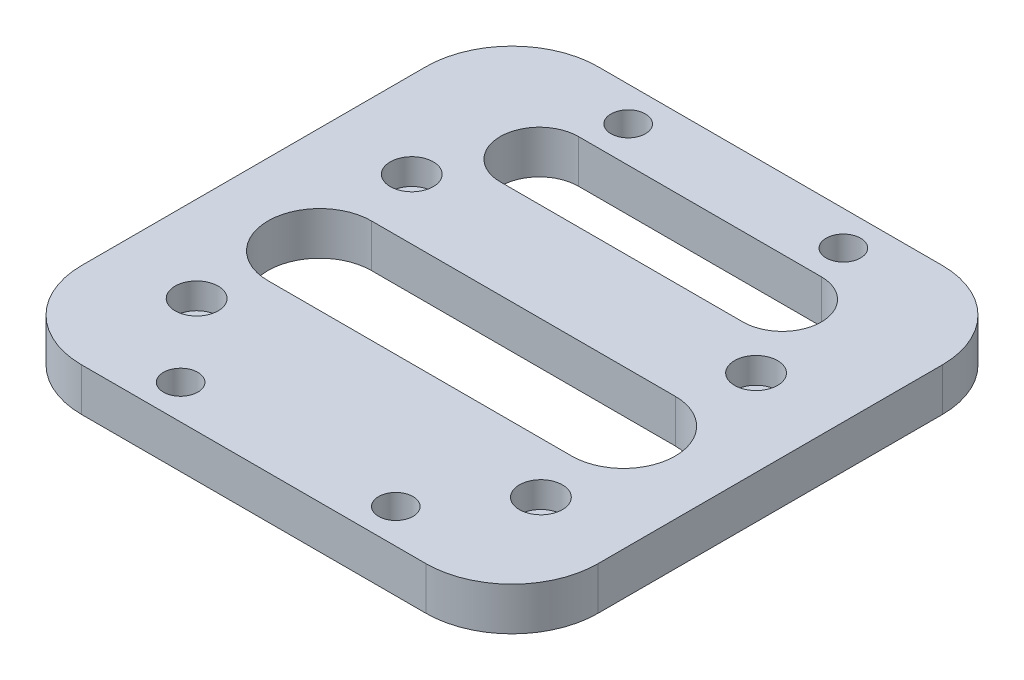
ISO-10303-21;
HEADER;
FILE_DESCRIPTION(('STEP AP214'),'2;1');
FILE_NAME('part.step','',(''),(''),'','','');
FILE_SCHEMA(('AUTOMOTIVE_DESIGN { 1 0 10303 214 1 1 1 1 }'));
ENDSEC;
DATA;
#1=APPLICATION_CONTEXT('core data for automotive mechanical design processes');
#2=APPLICATION_PROTOCOL_DEFINITION('international standard','automotive_design',2000,#1);
#3=PRODUCT_CONTEXT('',#1,'mechanical');
#4=PRODUCT('Part','Part','',(#3));
#5=PRODUCT_RELATED_PRODUCT_CATEGORY('part','',(#4));
#6=PRODUCT_DEFINITION_FORMATION('','',#4);
#7=PRODUCT_DEFINITION_CONTEXT('part definition',#1,'design');
#8=PRODUCT_DEFINITION('design','',#6,#7);
#9=PRODUCT_DEFINITION_SHAPE('','',#8);
#10=(LENGTH_UNIT() NAMED_UNIT(*) SI_UNIT(.MILLI.,.METRE.));
#11=(NAMED_UNIT(*) PLANE_ANGLE_UNIT() SI_UNIT($,.RADIAN.));
#12=(NAMED_UNIT(*) SI_UNIT($,.STERADIAN.) SOLID_ANGLE_UNIT());
#13=UNCERTAINTY_MEASURE_WITH_UNIT(LENGTH_MEASURE(1.E-05),#10,'distance_accuracy_value','');
#14=(GEOMETRIC_REPRESENTATION_CONTEXT(3) GLOBAL_UNCERTAINTY_ASSIGNED_CONTEXT((#13)) GLOBAL_UNIT_ASSIGNED_CONTEXT((#10,
#11,#12)) REPRESENTATION_CONTEXT('',''));
#15=CARTESIAN_POINT('',(0.,0.,0.));
#16=DIRECTION('',(0.,0.,1.));
#17=DIRECTION('',(1.,0.,0.));
#18=AXIS2_PLACEMENT_3D('',#15,#16,#17);
#19=CARTESIAN_POINT('',(50.,0.,-38.358507612628));
#20=DIRECTION('',(0.,1.,0.));
#21=DIRECTION('',(0.,0.,1.));
#22=AXIS2_PLACEMENT_3D('',#19,#20,#21);
#23=CYLINDRICAL_SURFACE('',#22,1.29999999999999);
#24=CARTESIAN_POINT('',(50.,0.,-38.358507612628));
#25=DIRECTION('',(0.,1.,0.));
#26=DIRECTION('',(0.,0.,1.));
#27=AXIS2_PLACEMENT_3D('',#24,#25,#26);
#28=CIRCLE('',#27,1.29999999999999);
#29=CARTESIAN_POINT('',(50.,0.,-37.058507612628));
#30=VERTEX_POINT('',#29);
#31=EDGE_CURVE('E246',#30,#30,#28,.T.);
#32=ORIENTED_EDGE('',*,*,#31,.F.);
#33=EDGE_LOOP('',(#32));
#34=FACE_BOUND('',#33,.T.);
#35=CARTESIAN_POINT('',(50.,2.,-38.358507612628));
#36=DIRECTION('',(0.,1.,0.));
#37=DIRECTION('',(0.,0.,1.));
#38=AXIS2_PLACEMENT_3D('',#35,#36,#37);
#39=CIRCLE('',#38,1.29999999999999);
#40=CARTESIAN_POINT('',(50.,2.,-37.058507612628));
#41=VERTEX_POINT('',#40);
#42=EDGE_CURVE('E249',#41,#41,#39,.F.);
#43=ORIENTED_EDGE('',*,*,#42,.F.);
#44=EDGE_LOOP('',(#43));
#45=FACE_BOUND('',#44,.T.);
#46=ADVANCED_FACE('F33',(#34,#45),#23,.F.);
#47=CARTESIAN_POINT('',(50.,0.,-13.358507612628));
#48=DIRECTION('',(0.,1.,0.));
#49=DIRECTION('',(0.,0.,1.));
#50=AXIS2_PLACEMENT_3D('',#47,#48,#49);
#51=CYLINDRICAL_SURFACE('',#50,1.29999999999999);
#52=CARTESIAN_POINT('',(50.,0.,-13.358507612628));
#53=DIRECTION('',(0.,1.,0.));
#54=DIRECTION('',(0.,0.,1.));
#55=AXIS2_PLACEMENT_3D('',#52,#53,#54);
#56=CIRCLE('',#55,1.29999999999999);
#57=CARTESIAN_POINT('',(50.,0.,-12.0585076126281));
#58=VERTEX_POINT('',#57);
#59=EDGE_CURVE('E243',#58,#58,#56,.T.);
#60=ORIENTED_EDGE('',*,*,#59,.F.);
#61=EDGE_LOOP('',(#60));
#62=FACE_BOUND('',#61,.T.);
#63=CARTESIAN_POINT('',(50.,2.,-13.358507612628));
#64=DIRECTION('',(0.,1.,0.));
#65=DIRECTION('',(0.,0.,1.));
#66=AXIS2_PLACEMENT_3D('',#63,#64,#65);
#67=CIRCLE('',#66,1.29999999999999);
#68=CARTESIAN_POINT('',(50.,2.,-12.0585076126281));
#69=VERTEX_POINT('',#68);
#70=EDGE_CURVE('E306',#69,#69,#67,.F.);
#71=ORIENTED_EDGE('',*,*,#70,.F.);
#72=EDGE_LOOP('',(#71));
#73=FACE_BOUND('',#72,.T.);
#74=ADVANCED_FACE('F388',(#62,#73),#51,.F.);
#75=CARTESIAN_POINT('',(10.,0.,-13.358507612628));
#76=DIRECTION('',(0.,1.,0.));
#77=DIRECTION('',(0.,0.,1.));
#78=AXIS2_PLACEMENT_3D('',#75,#76,#77);
#79=CYLINDRICAL_SURFACE('',#78,1.3);
#80=CARTESIAN_POINT('',(10.,0.,-13.358507612628));
#81=DIRECTION('',(0.,1.,0.));
#82=DIRECTION('',(0.,0.,1.));
#83=AXIS2_PLACEMENT_3D('',#80,#81,#82);
#84=CIRCLE('',#83,1.3);
#85=CARTESIAN_POINT('',(10.,0.,-12.058507612628));
#86=VERTEX_POINT('',#85);
#87=EDGE_CURVE('E239',#86,#86,#84,.T.);
#88=ORIENTED_EDGE('',*,*,#87,.F.);
#89=EDGE_LOOP('',(#88));
#90=FACE_BOUND('',#89,.T.);
#91=CARTESIAN_POINT('',(10.,2.,-13.358507612628));
#92=DIRECTION('',(0.,1.,0.));
#93=DIRECTION('',(0.,0.,1.));
#94=AXIS2_PLACEMENT_3D('',#91,#92,#93);
#95=CIRCLE('',#94,1.3);
#96=CARTESIAN_POINT('',(10.,2.,-12.058507612628));
#97=VERTEX_POINT('',#96);
#98=EDGE_CURVE('E303',#97,#97,#95,.F.);
#99=ORIENTED_EDGE('',*,*,#98,.F.);
#100=EDGE_LOOP('',(#99));
#101=FACE_BOUND('',#100,.T.);
#102=ADVANCED_FACE('F394',(#90,#101),#79,.F.);
#103=CARTESIAN_POINT('',(10.,0.,-38.358507612628));
#104=DIRECTION('',(0.,1.,0.));
#105=DIRECTION('',(0.,0.,1.));
#106=AXIS2_PLACEMENT_3D('',#103,#104,#105);
#107=CYLINDRICAL_SURFACE('',#106,1.3);
#108=CARTESIAN_POINT('',(10.,0.,-38.358507612628));
#109=DIRECTION('',(0.,1.,0.));
#110=DIRECTION('',(0.,0.,1.));
#111=AXIS2_PLACEMENT_3D('',#108,#109,#110);
#112=CIRCLE('',#111,1.3);
#113=CARTESIAN_POINT('',(10.,0.,-37.058507612628));
#114=VERTEX_POINT('',#113);
#115=EDGE_CURVE('E242',#114,#114,#112,.T.);
#116=ORIENTED_EDGE('',*,*,#115,.F.);
#117=EDGE_LOOP('',(#116));
#118=FACE_BOUND('',#117,.T.);
#119=CARTESIAN_POINT('',(10.,2.,-38.358507612628));
#120=DIRECTION('',(0.,1.,0.));
#121=DIRECTION('',(0.,0.,1.));
#122=AXIS2_PLACEMENT_3D('',#119,#120,#121);
#123=CIRCLE('',#122,1.3);
#124=CARTESIAN_POINT('',(10.,2.,-37.058507612628));
#125=VERTEX_POINT('',#124);
#126=EDGE_CURVE('E236',#125,#125,#123,.F.);
#127=ORIENTED_EDGE('',*,*,#126,.F.);
#128=EDGE_LOOP('',(#127));
#129=FACE_BOUND('',#128,.T.);
#130=ADVANCED_FACE('F415',(#118,#129),#107,.F.);
#131=CARTESIAN_POINT('',(0.,5.,0.));
#132=DIRECTION('',(1.,0.,0.));
#133=DIRECTION('',(0.,0.,-1.));
#134=AXIS2_PLACEMENT_3D('',#131,#132,#133);
#135=PLANE('',#134);
#136=DIRECTION('',(0.,0.,1.));
#137=VECTOR('',#136,1.);
#138=CARTESIAN_POINT('',(0.,0.,0.));
#139=LINE('',#138,#137);
#140=CARTESIAN_POINT('',(0.,0.,-50.));
#141=VERTEX_POINT('',#140);
#142=CARTESIAN_POINT('',(0.,0.,-10.));
#143=VERTEX_POINT('',#142);
#144=EDGE_CURVE('E274',#141,#143,#139,.T.);
#145=ORIENTED_EDGE('',*,*,#144,.T.);
#146=DIRECTION('',(0.,-1.,0.));
#147=VECTOR('',#146,1.);
#148=CARTESIAN_POINT('',(0.,5.,-10.));
#149=LINE('',#148,#147);
#150=CARTESIAN_POINT('',(0.,5.,-10.));
#151=VERTEX_POINT('',#150);
#152=EDGE_CURVE('E11',#143,#151,#149,.F.);
#153=ORIENTED_EDGE('',*,*,#152,.T.);
#154=DIRECTION('',(0.,0.,1.));
#155=VECTOR('',#154,1.);
#156=CARTESIAN_POINT('',(0.,5.,0.));
#157=LINE('',#156,#155);
#158=CARTESIAN_POINT('',(0.,5.,-50.));
#159=VERTEX_POINT('',#158);
#160=EDGE_CURVE('E277',#159,#151,#157,.T.);
#161=ORIENTED_EDGE('',*,*,#160,.F.);
#162=DIRECTION('',(0.,-1.,0.));
#163=VECTOR('',#162,1.);
#164=CARTESIAN_POINT('',(0.,5.,-50.));
#165=LINE('',#164,#163);
#166=EDGE_CURVE('E41',#159,#141,#165,.T.);
#167=ORIENTED_EDGE('',*,*,#166,.T.);
#168=EDGE_LOOP('',(#145,#153,#161,#167));
#169=FACE_BOUND('',#168,.T.);
#170=ADVANCED_FACE('F345',(#169),#135,.F.);
#171=CARTESIAN_POINT('',(0.,5.,0.));
#172=DIRECTION('',(0.,0.,-1.));
#173=DIRECTION('',(-1.,0.,0.));
#174=AXIS2_PLACEMENT_3D('',#171,#172,#173);
#175=PLANE('',#174);
#176=DIRECTION('',(1.,0.,0.));
#177=VECTOR('',#176,1.);
#178=CARTESIAN_POINT('',(0.,0.,0.));
#179=LINE('',#178,#177);
#180=CARTESIAN_POINT('',(10.,0.,0.));
#181=VERTEX_POINT('',#180);
#182=CARTESIAN_POINT('',(50.,0.,0.));
#183=VERTEX_POINT('',#182);
#184=EDGE_CURVE('E293',#181,#183,#179,.T.);
#185=ORIENTED_EDGE('',*,*,#184,.T.);
#186=DIRECTION('',(0.,-1.,0.));
#187=VECTOR('',#186,1.);
#188=CARTESIAN_POINT('',(50.,5.,0.));
#189=LINE('',#188,#187);
#190=CARTESIAN_POINT('',(50.,5.,0.));
#191=VERTEX_POINT('',#190);
#192=EDGE_CURVE('E326',#183,#191,#189,.F.);
#193=ORIENTED_EDGE('',*,*,#192,.T.);
#194=DIRECTION('',(1.,0.,0.));
#195=VECTOR('',#194,1.);
#196=CARTESIAN_POINT('',(0.,5.,0.));
#197=LINE('',#196,#195);
#198=CARTESIAN_POINT('',(10.,5.,0.));
#199=VERTEX_POINT('',#198);
#200=EDGE_CURVE('E280',#199,#191,#197,.T.);
#201=ORIENTED_EDGE('',*,*,#200,.F.);
#202=DIRECTION('',(0.,-1.,0.));
#203=VECTOR('',#202,1.);
#204=CARTESIAN_POINT('',(10.,5.,0.));
#205=LINE('',#204,#203);
#206=EDGE_CURVE('E323',#199,#181,#205,.T.);
#207=ORIENTED_EDGE('',*,*,#206,.T.);
#208=EDGE_LOOP('',(#185,#193,#201,#207));
#209=FACE_BOUND('',#208,.T.);
#210=ADVANCED_FACE('F359',(#209),#175,.F.);
#211=CARTESIAN_POINT('',(60.,5.,0.));
#212=DIRECTION('',(-1.,0.,0.));
#213=DIRECTION('',(0.,0.,1.));
#214=AXIS2_PLACEMENT_3D('',#211,#212,#213);
#215=PLANE('',#214);
#216=DIRECTION('',(0.,0.,-1.));
#217=VECTOR('',#216,1.);
#218=CARTESIAN_POINT('',(60.,5.,0.));
#219=LINE('',#218,#217);
#220=CARTESIAN_POINT('',(60.,5.,-10.));
#221=VERTEX_POINT('',#220);
#222=CARTESIAN_POINT('',(60.,5.,-50.));
#223=VERTEX_POINT('',#222);
#224=EDGE_CURVE('E284',#221,#223,#219,.T.);
#225=ORIENTED_EDGE('',*,*,#224,.F.);
#226=DIRECTION('',(0.,-1.,0.));
#227=VECTOR('',#226,1.);
#228=CARTESIAN_POINT('',(60.,5.,-10.));
#229=LINE('',#228,#227);
#230=CARTESIAN_POINT('',(60.,0.,-10.));
#231=VERTEX_POINT('',#230);
#232=EDGE_CURVE('E312',#221,#231,#229,.T.);
#233=ORIENTED_EDGE('',*,*,#232,.T.);
#234=DIRECTION('',(0.,0.,-1.));
#235=VECTOR('',#234,1.);
#236=CARTESIAN_POINT('',(60.,0.,0.));
#237=LINE('',#236,#235);
#238=CARTESIAN_POINT('',(60.,0.,-50.));
#239=VERTEX_POINT('',#238);
#240=EDGE_CURVE('E296',#231,#239,#237,.T.);
#241=ORIENTED_EDGE('',*,*,#240,.T.);
#242=DIRECTION('',(0.,-1.,0.));
#243=VECTOR('',#242,1.);
#244=CARTESIAN_POINT('',(60.,5.,-50.));
#245=LINE('',#244,#243);
#246=EDGE_CURVE('E290',#239,#223,#245,.F.);
#247=ORIENTED_EDGE('',*,*,#246,.T.);
#248=EDGE_LOOP('',(#225,#233,#241,#247));
#249=FACE_BOUND('',#248,.T.);
#250=ADVANCED_FACE('F369',(#249),#215,.F.);
#251=CARTESIAN_POINT('',(0.,5.,-60.));
#252=DIRECTION('',(0.,0.,1.));
#253=DIRECTION('',(1.,0.,0.));
#254=AXIS2_PLACEMENT_3D('',#251,#252,#253);
#255=PLANE('',#254);
#256=DIRECTION('',(-1.,0.,0.));
#257=VECTOR('',#256,1.);
#258=CARTESIAN_POINT('',(0.,5.,-60.));
#259=LINE('',#258,#257);
#260=CARTESIAN_POINT('',(50.,5.,-60.));
#261=VERTEX_POINT('',#260);
#262=CARTESIAN_POINT('',(10.,5.,-60.));
#263=VERTEX_POINT('',#262);
#264=EDGE_CURVE('E287',#261,#263,#259,.T.);
#265=ORIENTED_EDGE('',*,*,#264,.F.);
#266=DIRECTION('',(0.,-1.,0.));
#267=VECTOR('',#266,1.);
#268=CARTESIAN_POINT('',(50.,5.,-60.));
#269=LINE('',#268,#267);
#270=CARTESIAN_POINT('',(50.,0.,-60.));
#271=VERTEX_POINT('',#270);
#272=EDGE_CURVE('E338',#261,#271,#269,.T.);
#273=ORIENTED_EDGE('',*,*,#272,.T.);
#274=DIRECTION('',(-1.,0.,0.));
#275=VECTOR('',#274,1.);
#276=CARTESIAN_POINT('',(0.,0.,-60.));
#277=LINE('',#276,#275);
#278=CARTESIAN_POINT('',(10.,0.,-60.));
#279=VERTEX_POINT('',#278);
#280=EDGE_CURVE('E281',#271,#279,#277,.T.);
#281=ORIENTED_EDGE('',*,*,#280,.T.);
#282=DIRECTION('',(0.,-1.,0.));
#283=VECTOR('',#282,1.);
#284=CARTESIAN_POINT('',(10.,5.,-60.));
#285=LINE('',#284,#283);
#286=EDGE_CURVE('E336',#279,#263,#285,.F.);
#287=ORIENTED_EDGE('',*,*,#286,.T.);
#288=EDGE_LOOP('',(#265,#273,#281,#287));
#289=FACE_BOUND('',#288,.T.);
#290=ADVANCED_FACE('F377',(#289),#255,.F.);
#291=CARTESIAN_POINT('',(0.,5.,0.));
#292=DIRECTION('',(0.,-1.,0.));
#293=DIRECTION('',(0.,0.,-1.));
#294=AXIS2_PLACEMENT_3D('',#291,#292,#293);
#295=PLANE('',#294);
#296=DIRECTION('',(1.,0.,0.));
#297=VECTOR('',#296,1.);
#298=CARTESIAN_POINT('',(15.8935843316395,5.,-42.7294946170664));
#299=LINE('',#298,#297);
#300=CARTESIAN_POINT('',(15.8935843316395,5.,-42.7294946170664));
#301=VERTEX_POINT('',#300);
#302=CARTESIAN_POINT('',(44.1064156683605,5.,-42.7294946170664));
#303=VERTEX_POINT('',#302);
#304=EDGE_CURVE('E175',#301,#303,#299,.T.);
#305=ORIENTED_EDGE('',*,*,#304,.F.);
#306=CARTESIAN_POINT('',(15.8935843316395,5.,-47.2817642152225));
#307=DIRECTION('',(0.,1.,0.));
#308=DIRECTION('',(0.,0.,1.));
#309=AXIS2_PLACEMENT_3D('',#306,#307,#308);
#310=CIRCLE('',#309,4.55226959815617);
#311=CARTESIAN_POINT('',(15.8935843316395,5.,-51.8340338133787));
#312=VERTEX_POINT('',#311);
#313=EDGE_CURVE('E48',#312,#301,#310,.T.);
#314=ORIENTED_EDGE('',*,*,#313,.F.);
#315=DIRECTION('',(-1.,0.,0.));
#316=VECTOR('',#315,1.);
#317=CARTESIAN_POINT('',(15.8935843316395,5.,-51.8340338133787));
#318=LINE('',#317,#316);
#319=CARTESIAN_POINT('',(44.1064156683605,5.,-51.8340338133787));
#320=VERTEX_POINT('',#319);
#321=EDGE_CURVE('E166',#320,#312,#318,.T.);
#322=ORIENTED_EDGE('',*,*,#321,.F.);
#323=CARTESIAN_POINT('',(44.1064156683605,5.,-47.2817642152225));
#324=DIRECTION('',(0.,1.,0.));
#325=DIRECTION('',(0.,0.,1.));
#326=AXIS2_PLACEMENT_3D('',#323,#324,#325);
#327=CIRCLE('',#326,4.55226959815617);
#328=EDGE_CURVE('E169',#303,#320,#327,.T.);
#329=ORIENTED_EDGE('',*,*,#328,.F.);
#330=EDGE_LOOP('',(#305,#314,#322,#329));
#331=FACE_BOUND('',#330,.T.);
#332=DIRECTION('',(1.,0.,0.));
#333=VECTOR('',#332,1.);
#334=CARTESIAN_POINT('',(12.3529301997403,5.,-19.2937363154475));
#335=LINE('',#334,#333);
#336=CARTESIAN_POINT('',(12.3529301997403,5.,-19.2937363154475));
#337=VERTEX_POINT('',#336);
#338=CARTESIAN_POINT('',(47.6470698002597,5.,-19.2937363154475));
#339=VERTEX_POINT('',#338);
#340=EDGE_CURVE('E201',#337,#339,#335,.T.);
#341=ORIENTED_EDGE('',*,*,#340,.F.);
#342=CARTESIAN_POINT('',(12.3529301997403,5.,-25.3072282537526));
#343=DIRECTION('',(0.,1.,0.));
#344=DIRECTION('',(0.,0.,1.));
#345=AXIS2_PLACEMENT_3D('',#342,#343,#344);
#346=CIRCLE('',#345,6.01349193830507);
#347=CARTESIAN_POINT('',(12.3529301997403,5.,-31.3207201920577));
#348=VERTEX_POINT('',#347);
#349=EDGE_CURVE('E56',#348,#337,#346,.T.);
#350=ORIENTED_EDGE('',*,*,#349,.F.);
#351=DIRECTION('',(-1.,0.,0.));
#352=VECTOR('',#351,1.);
#353=CARTESIAN_POINT('',(12.3529301997403,5.,-31.3207201920577));
#354=LINE('',#353,#352);
#355=CARTESIAN_POINT('',(47.6470698002597,5.,-31.3207201920577));
#356=VERTEX_POINT('',#355);
#357=EDGE_CURVE('E190',#356,#348,#354,.T.);
#358=ORIENTED_EDGE('',*,*,#357,.F.);
#359=CARTESIAN_POINT('',(47.6470698002597,5.,-25.3072282537526));
#360=DIRECTION('',(0.,1.,0.));
#361=DIRECTION('',(0.,0.,1.));
#362=AXIS2_PLACEMENT_3D('',#359,#360,#361);
#363=CIRCLE('',#362,6.01349193830507);
#364=EDGE_CURVE('E204',#339,#356,#363,.T.);
#365=ORIENTED_EDGE('',*,*,#364,.F.);
#366=EDGE_LOOP('',(#341,#350,#358,#365));
#367=FACE_BOUND('',#366,.T.);
#368=CARTESIAN_POINT('',(50.,5.,-38.358507612628));
#369=DIRECTION('',(0.,1.,0.));
#370=DIRECTION('',(0.,0.,1.));
#371=AXIS2_PLACEMENT_3D('',#368,#369,#370);
#372=CIRCLE('',#371,2.5);
#373=CARTESIAN_POINT('',(50.,5.,-35.8585076126281));
#374=VERTEX_POINT('',#373);
#375=EDGE_CURVE('E182',#374,#374,#372,.T.);
#376=ORIENTED_EDGE('',*,*,#375,.F.);
#377=EDGE_LOOP('',(#376));
#378=FACE_BOUND('',#377,.T.);
#379=CARTESIAN_POINT('',(50.,5.,-13.358507612628));
#380=DIRECTION('',(0.,1.,0.));
#381=DIRECTION('',(0.,0.,1.));
#382=AXIS2_PLACEMENT_3D('',#379,#380,#381);
#383=CIRCLE('',#382,2.49999999999999);
#384=CARTESIAN_POINT('',(50.,5.,-10.858507612628));
#385=VERTEX_POINT('',#384);
#386=EDGE_CURVE('E225',#385,#385,#383,.T.);
#387=ORIENTED_EDGE('',*,*,#386,.F.);
#388=EDGE_LOOP('',(#387));
#389=FACE_BOUND('',#388,.T.);
#390=CARTESIAN_POINT('',(10.,5.,-13.358507612628));
#391=DIRECTION('',(0.,1.,0.));
#392=DIRECTION('',(0.,0.,1.));
#393=AXIS2_PLACEMENT_3D('',#390,#391,#392);
#394=CIRCLE('',#393,2.5);
#395=CARTESIAN_POINT('',(10.,5.,-10.858507612628));
#396=VERTEX_POINT('',#395);
#397=EDGE_CURVE('E219',#396,#396,#394,.T.);
#398=ORIENTED_EDGE('',*,*,#397,.F.);
#399=EDGE_LOOP('',(#398));
#400=FACE_BOUND('',#399,.T.);
#401=CARTESIAN_POINT('',(10.,5.,-38.358507612628));
#402=DIRECTION('',(0.,1.,0.));
#403=DIRECTION('',(0.,0.,1.));
#404=AXIS2_PLACEMENT_3D('',#401,#402,#403);
#405=CIRCLE('',#404,2.5);
#406=CARTESIAN_POINT('',(10.,5.,-35.858507612628));
#407=VERTEX_POINT('',#406);
#408=EDGE_CURVE('E218',#407,#407,#405,.T.);
#409=ORIENTED_EDGE('',*,*,#408,.F.);
#410=EDGE_LOOP('',(#409));
#411=FACE_BOUND('',#410,.T.);
#412=CARTESIAN_POINT('',(17.5,5.,-4.));
#413=DIRECTION('',(0.,1.,0.));
#414=DIRECTION('',(0.,0.,1.));
#415=AXIS2_PLACEMENT_3D('',#412,#413,#414);
#416=CIRCLE('',#415,2.);
#417=CARTESIAN_POINT('',(17.5,5.,-2.));
#418=VERTEX_POINT('',#417);
#419=EDGE_CURVE('E254',#418,#418,#416,.T.);
#420=ORIENTED_EDGE('',*,*,#419,.F.);
#421=EDGE_LOOP('',(#420));
#422=FACE_BOUND('',#421,.T.);
#423=CARTESIAN_POINT('',(42.5,5.,-4.));
#424=DIRECTION('',(0.,1.,0.));
#425=DIRECTION('',(0.,0.,1.));
#426=AXIS2_PLACEMENT_3D('',#423,#424,#425);
#427=CIRCLE('',#426,2.);
#428=CARTESIAN_POINT('',(42.5,5.,-2.));
#429=VERTEX_POINT('',#428);
#430=EDGE_CURVE('E260',#429,#429,#427,.T.);
#431=ORIENTED_EDGE('',*,*,#430,.F.);
#432=EDGE_LOOP('',(#431));
#433=FACE_BOUND('',#432,.T.);
#434=CARTESIAN_POINT('',(42.5,5.,-56.));
#435=DIRECTION('',(0.,1.,0.));
#436=DIRECTION('',(0.,0.,1.));
#437=AXIS2_PLACEMENT_3D('',#434,#435,#436);
#438=CIRCLE('',#437,2.);
#439=CARTESIAN_POINT('',(42.5,5.,-54.));
#440=VERTEX_POINT('',#439);
#441=EDGE_CURVE('E266',#440,#440,#438,.T.);
#442=ORIENTED_EDGE('',*,*,#441,.F.);
#443=EDGE_LOOP('',(#442));
#444=FACE_BOUND('',#443,.T.);
#445=CARTESIAN_POINT('',(17.5,5.,-56.));
#446=DIRECTION('',(0.,1.,0.));
#447=DIRECTION('',(0.,0.,1.));
#448=AXIS2_PLACEMENT_3D('',#445,#446,#447);
#449=CIRCLE('',#448,2.);
#450=CARTESIAN_POINT('',(17.5,5.,-54.));
#451=VERTEX_POINT('',#450);
#452=EDGE_CURVE('E253',#451,#451,#449,.T.);
#453=ORIENTED_EDGE('',*,*,#452,.F.);
#454=EDGE_LOOP('',(#453));
#455=FACE_BOUND('',#454,.T.);
#456=ORIENTED_EDGE('',*,*,#200,.T.);
#457=CARTESIAN_POINT('',(50.,5.,-10.));
#458=DIRECTION('',(0.,-1.,0.));
#459=DIRECTION('',(0.,0.,-1.));
#460=AXIS2_PLACEMENT_3D('',#457,#458,#459);
#461=CIRCLE('',#460,10.);
#462=EDGE_CURVE('E334',#191,#221,#461,.F.);
#463=ORIENTED_EDGE('',*,*,#462,.T.);
#464=ORIENTED_EDGE('',*,*,#224,.T.);
#465=CARTESIAN_POINT('',(50.,5.,-50.));
#466=DIRECTION('',(0.,-1.,0.));
#467=DIRECTION('',(0.,0.,-1.));
#468=AXIS2_PLACEMENT_3D('',#465,#466,#467);
#469=CIRCLE('',#468,10.);
#470=EDGE_CURVE('E332',#223,#261,#469,.F.);
#471=ORIENTED_EDGE('',*,*,#470,.T.);
#472=ORIENTED_EDGE('',*,*,#264,.T.);
#473=CARTESIAN_POINT('',(10.,5.,-50.));
#474=DIRECTION('',(0.,-1.,0.));
#475=DIRECTION('',(0.,0.,-1.));
#476=AXIS2_PLACEMENT_3D('',#473,#474,#475);
#477=CIRCLE('',#476,10.);
#478=EDGE_CURVE('E328',#263,#159,#477,.F.);
#479=ORIENTED_EDGE('',*,*,#478,.T.);
#480=ORIENTED_EDGE('',*,*,#160,.T.);
#481=CARTESIAN_POINT('',(10.,5.,-10.));
#482=DIRECTION('',(0.,-1.,0.));
#483=DIRECTION('',(0.,0.,-1.));
#484=AXIS2_PLACEMENT_3D('',#481,#482,#483);
#485=CIRCLE('',#484,10.);
#486=EDGE_CURVE('E330',#151,#199,#485,.F.);
#487=ORIENTED_EDGE('',*,*,#486,.T.);
#488=EDGE_LOOP('',(#456,#463,#464,#471,#472,#479,#480,#487));
#489=FACE_BOUND('',#488,.T.);
#490=ADVANCED_FACE('F363',(#331,#367,#378,#389,#400,#411,#422,#433,#444,#455,#489),#295,.F.);
#491=CARTESIAN_POINT('',(0.,0.,0.));
#492=DIRECTION('',(0.,-1.,0.));
#493=DIRECTION('',(0.,0.,-1.));
#494=AXIS2_PLACEMENT_3D('',#491,#492,#493);
#495=PLANE('',#494);
#496=CARTESIAN_POINT('',(15.8935843316395,0.,-47.2817642152225));
#497=DIRECTION('',(0.,1.,0.));
#498=DIRECTION('',(0.,0.,1.));
#499=AXIS2_PLACEMENT_3D('',#496,#497,#498);
#500=CIRCLE('',#499,4.55226959815617);
#501=CARTESIAN_POINT('',(15.8935843316395,0.,-51.8340338133787));
#502=VERTEX_POINT('',#501);
#503=CARTESIAN_POINT('',(15.8935843316395,0.,-42.7294946170664));
#504=VERTEX_POINT('',#503);
#505=EDGE_CURVE('E147',#502,#504,#500,.T.);
#506=ORIENTED_EDGE('',*,*,#505,.T.);
#507=DIRECTION('',(1.,0.,0.));
#508=VECTOR('',#507,1.);
#509=CARTESIAN_POINT('',(15.8935843316395,0.,-42.7294946170664));
#510=LINE('',#509,#508);
#511=CARTESIAN_POINT('',(44.1064156683605,0.,-42.7294946170664));
#512=VERTEX_POINT('',#511);
#513=EDGE_CURVE('E157',#504,#512,#510,.T.);
#514=ORIENTED_EDGE('',*,*,#513,.T.);
#515=CARTESIAN_POINT('',(44.1064156683605,0.,-47.2817642152225));
#516=DIRECTION('',(0.,1.,0.));
#517=DIRECTION('',(0.,0.,1.));
#518=AXIS2_PLACEMENT_3D('',#515,#516,#517);
#519=CIRCLE('',#518,4.55226959815617);
#520=CARTESIAN_POINT('',(44.1064156683605,0.,-51.8340338133787));
#521=VERTEX_POINT('',#520);
#522=EDGE_CURVE('E161',#512,#521,#519,.T.);
#523=ORIENTED_EDGE('',*,*,#522,.T.);
#524=DIRECTION('',(-1.,0.,0.));
#525=VECTOR('',#524,1.);
#526=CARTESIAN_POINT('',(15.8935843316395,0.,-51.8340338133787));
#527=LINE('',#526,#525);
#528=EDGE_CURVE('E153',#521,#502,#527,.T.);
#529=ORIENTED_EDGE('',*,*,#528,.T.);
#530=EDGE_LOOP('',(#506,#514,#523,#529));
#531=FACE_BOUND('',#530,.T.);
#532=CARTESIAN_POINT('',(12.3529301997403,0.,-25.3072282537526));
#533=DIRECTION('',(0.,1.,0.));
#534=DIRECTION('',(0.,0.,1.));
#535=AXIS2_PLACEMENT_3D('',#532,#533,#534);
#536=CIRCLE('',#535,6.01349193830507);
#537=CARTESIAN_POINT('',(12.3529301997403,0.,-31.3207201920577));
#538=VERTEX_POINT('',#537);
#539=CARTESIAN_POINT('',(12.3529301997403,0.,-19.2937363154475));
#540=VERTEX_POINT('',#539);
#541=EDGE_CURVE('E186',#538,#540,#536,.T.);
#542=ORIENTED_EDGE('',*,*,#541,.T.);
#543=DIRECTION('',(1.,0.,0.));
#544=VECTOR('',#543,1.);
#545=CARTESIAN_POINT('',(12.3529301997403,0.,-19.2937363154475));
#546=LINE('',#545,#544);
#547=CARTESIAN_POINT('',(47.6470698002597,0.,-19.2937363154475));
#548=VERTEX_POINT('',#547);
#549=EDGE_CURVE('E189',#540,#548,#546,.T.);
#550=ORIENTED_EDGE('',*,*,#549,.T.);
#551=CARTESIAN_POINT('',(47.6470698002597,0.,-25.3072282537526));
#552=DIRECTION('',(0.,1.,0.));
#553=DIRECTION('',(0.,0.,1.));
#554=AXIS2_PLACEMENT_3D('',#551,#552,#553);
#555=CIRCLE('',#554,6.01349193830507);
#556=CARTESIAN_POINT('',(47.6470698002597,0.,-31.3207201920577));
#557=VERTEX_POINT('',#556);
#558=EDGE_CURVE('E193',#548,#557,#555,.T.);
#559=ORIENTED_EDGE('',*,*,#558,.T.);
#560=DIRECTION('',(-1.,0.,0.));
#561=VECTOR('',#560,1.);
#562=CARTESIAN_POINT('',(12.3529301997403,0.,-31.3207201920577));
#563=LINE('',#562,#561);
#564=EDGE_CURVE('E196',#557,#538,#563,.T.);
#565=ORIENTED_EDGE('',*,*,#564,.T.);
#566=EDGE_LOOP('',(#542,#550,#559,#565));
#567=FACE_BOUND('',#566,.T.);
#568=CARTESIAN_POINT('',(17.5,0.,-4.));
#569=DIRECTION('',(0.,1.,0.));
#570=DIRECTION('',(0.,0.,1.));
#571=AXIS2_PLACEMENT_3D('',#568,#569,#570);
#572=CIRCLE('',#571,2.);
#573=CARTESIAN_POINT('',(17.5,0.,-2.));
#574=VERTEX_POINT('',#573);
#575=EDGE_CURVE('E250',#574,#574,#572,.T.);
#576=ORIENTED_EDGE('',*,*,#575,.T.);
#577=EDGE_LOOP('',(#576));
#578=FACE_BOUND('',#577,.T.);
#579=CARTESIAN_POINT('',(42.5,0.,-4.));
#580=DIRECTION('',(0.,1.,0.));
#581=DIRECTION('',(0.,0.,1.));
#582=AXIS2_PLACEMENT_3D('',#579,#580,#581);
#583=CIRCLE('',#582,2.);
#584=CARTESIAN_POINT('',(42.5,0.,-2.));
#585=VERTEX_POINT('',#584);
#586=EDGE_CURVE('E257',#585,#585,#583,.T.);
#587=ORIENTED_EDGE('',*,*,#586,.T.);
#588=EDGE_LOOP('',(#587));
#589=FACE_BOUND('',#588,.T.);
#590=CARTESIAN_POINT('',(42.5,0.,-56.));
#591=DIRECTION('',(0.,1.,0.));
#592=DIRECTION('',(0.,0.,1.));
#593=AXIS2_PLACEMENT_3D('',#590,#591,#592);
#594=CIRCLE('',#593,2.);
#595=CARTESIAN_POINT('',(42.5,0.,-54.));
#596=VERTEX_POINT('',#595);
#597=EDGE_CURVE('E263',#596,#596,#594,.T.);
#598=ORIENTED_EDGE('',*,*,#597,.T.);
#599=EDGE_LOOP('',(#598));
#600=FACE_BOUND('',#599,.T.);
#601=ORIENTED_EDGE('',*,*,#115,.T.);
#602=EDGE_LOOP('',(#601));
#603=FACE_BOUND('',#602,.T.);
#604=ORIENTED_EDGE('',*,*,#87,.T.);
#605=EDGE_LOOP('',(#604));
#606=FACE_BOUND('',#605,.T.);
#607=ORIENTED_EDGE('',*,*,#59,.T.);
#608=EDGE_LOOP('',(#607));
#609=FACE_BOUND('',#608,.T.);
#610=ORIENTED_EDGE('',*,*,#31,.T.);
#611=EDGE_LOOP('',(#610));
#612=FACE_BOUND('',#611,.T.);
#613=CARTESIAN_POINT('',(17.5,0.,-56.));
#614=DIRECTION('',(0.,1.,0.));
#615=DIRECTION('',(0.,0.,1.));
#616=AXIS2_PLACEMENT_3D('',#613,#614,#615);
#617=CIRCLE('',#616,2.);
#618=CARTESIAN_POINT('',(17.5,0.,-54.));
#619=VERTEX_POINT('',#618);
#620=EDGE_CURVE('E271',#619,#619,#617,.T.);
#621=ORIENTED_EDGE('',*,*,#620,.T.);
#622=EDGE_LOOP('',(#621));
#623=FACE_BOUND('',#622,.T.);
#624=ORIENTED_EDGE('',*,*,#240,.F.);
#625=CARTESIAN_POINT('',(50.,0.,-10.));
#626=DIRECTION('',(0.,-1.,0.));
#627=DIRECTION('',(0.,0.,-1.));
#628=AXIS2_PLACEMENT_3D('',#625,#626,#627);
#629=CIRCLE('',#628,10.);
#630=EDGE_CURVE('E321',#231,#183,#629,.T.);
#631=ORIENTED_EDGE('',*,*,#630,.T.);
#632=ORIENTED_EDGE('',*,*,#184,.F.);
#633=CARTESIAN_POINT('',(10.,0.,-10.));
#634=DIRECTION('',(0.,-1.,0.));
#635=DIRECTION('',(0.,0.,-1.));
#636=AXIS2_PLACEMENT_3D('',#633,#634,#635);
#637=CIRCLE('',#636,10.);
#638=EDGE_CURVE('E317',#181,#143,#637,.T.);
#639=ORIENTED_EDGE('',*,*,#638,.T.);
#640=ORIENTED_EDGE('',*,*,#144,.F.);
#641=CARTESIAN_POINT('',(10.,0.,-50.));
#642=DIRECTION('',(0.,-1.,0.));
#643=DIRECTION('',(0.,0.,-1.));
#644=AXIS2_PLACEMENT_3D('',#641,#642,#643);
#645=CIRCLE('',#644,10.);
#646=EDGE_CURVE('E315',#141,#279,#645,.T.);
#647=ORIENTED_EDGE('',*,*,#646,.T.);
#648=ORIENTED_EDGE('',*,*,#280,.F.);
#649=CARTESIAN_POINT('',(50.,0.,-50.));
#650=DIRECTION('',(0.,-1.,0.));
#651=DIRECTION('',(0.,0.,-1.));
#652=AXIS2_PLACEMENT_3D('',#649,#650,#651);
#653=CIRCLE('',#652,10.);
#654=EDGE_CURVE('E319',#271,#239,#653,.T.);
#655=ORIENTED_EDGE('',*,*,#654,.T.);
#656=EDGE_LOOP('',(#624,#631,#632,#639,#640,#647,#648,#655));
#657=FACE_BOUND('',#656,.T.);
#658=ADVANCED_FACE('F163',(#531,#567,#578,#589,#600,#603,#606,#609,#612,#623,#657),#495,.T.);
#659=CARTESIAN_POINT('',(17.5,0.,-56.));
#660=DIRECTION('',(0.,1.,0.));
#661=DIRECTION('',(0.,0.,1.));
#662=AXIS2_PLACEMENT_3D('',#659,#660,#661);
#663=CYLINDRICAL_SURFACE('',#662,2.);
#664=ORIENTED_EDGE('',*,*,#620,.F.);
#665=EDGE_LOOP('',(#664));
#666=FACE_BOUND('',#665,.T.);
#667=ORIENTED_EDGE('',*,*,#452,.T.);
#668=EDGE_LOOP('',(#667));
#669=FACE_BOUND('',#668,.T.);
#670=ADVANCED_FACE('F413',(#666,#669),#663,.F.);
#671=CARTESIAN_POINT('',(42.5,0.,-56.));
#672=DIRECTION('',(0.,1.,0.));
#673=DIRECTION('',(0.,0.,1.));
#674=AXIS2_PLACEMENT_3D('',#671,#672,#673);
#675=CYLINDRICAL_SURFACE('',#674,2.);
#676=ORIENTED_EDGE('',*,*,#597,.F.);
#677=EDGE_LOOP('',(#676));
#678=FACE_BOUND('',#677,.T.);
#679=ORIENTED_EDGE('',*,*,#441,.T.);
#680=EDGE_LOOP('',(#679));
#681=FACE_BOUND('',#680,.T.);
#682=ADVANCED_FACE('F409',(#678,#681),#675,.F.);
#683=CARTESIAN_POINT('',(42.5,0.,-4.));
#684=DIRECTION('',(0.,1.,0.));
#685=DIRECTION('',(0.,0.,1.));
#686=AXIS2_PLACEMENT_3D('',#683,#684,#685);
#687=CYLINDRICAL_SURFACE('',#686,2.);
#688=ORIENTED_EDGE('',*,*,#586,.F.);
#689=EDGE_LOOP('',(#688));
#690=FACE_BOUND('',#689,.T.);
#691=ORIENTED_EDGE('',*,*,#430,.T.);
#692=EDGE_LOOP('',(#691));
#693=FACE_BOUND('',#692,.T.);
#694=ADVANCED_FACE('F405',(#690,#693),#687,.F.);
#695=CARTESIAN_POINT('',(17.5,0.,-4.));
#696=DIRECTION('',(0.,1.,0.));
#697=DIRECTION('',(0.,0.,1.));
#698=AXIS2_PLACEMENT_3D('',#695,#696,#697);
#699=CYLINDRICAL_SURFACE('',#698,2.);
#700=ORIENTED_EDGE('',*,*,#575,.F.);
#701=EDGE_LOOP('',(#700));
#702=FACE_BOUND('',#701,.T.);
#703=ORIENTED_EDGE('',*,*,#419,.T.);
#704=EDGE_LOOP('',(#703));
#705=FACE_BOUND('',#704,.T.);
#706=ADVANCED_FACE('F401',(#702,#705),#699,.F.);
#707=CARTESIAN_POINT('',(10.,2.,-38.358507612628));
#708=DIRECTION('',(0.,1.,0.));
#709=DIRECTION('',(0.,0.,1.));
#710=AXIS2_PLACEMENT_3D('',#707,#708,#709);
#711=PLANE('',#710);
#712=CARTESIAN_POINT('',(10.,2.,-38.358507612628));
#713=DIRECTION('',(0.,1.,0.));
#714=DIRECTION('',(0.,0.,1.));
#715=AXIS2_PLACEMENT_3D('',#712,#713,#714);
#716=CIRCLE('',#715,2.5);
#717=CARTESIAN_POINT('',(10.,2.,-35.858507612628));
#718=VERTEX_POINT('',#717);
#719=EDGE_CURVE('E233',#718,#718,#716,.T.);
#720=ORIENTED_EDGE('',*,*,#719,.T.);
#721=EDGE_LOOP('',(#720));
#722=FACE_BOUND('',#721,.T.);
#723=ORIENTED_EDGE('',*,*,#126,.T.);
#724=EDGE_LOOP('',(#723));
#725=FACE_BOUND('',#724,.T.);
#726=ADVANCED_FACE('F404',(#722,#725),#711,.T.);
#727=CARTESIAN_POINT('',(10.,2.,-38.358507612628));
#728=DIRECTION('',(0.,1.,0.));
#729=DIRECTION('',(0.,0.,1.));
#730=AXIS2_PLACEMENT_3D('',#727,#728,#729);
#731=CYLINDRICAL_SURFACE('',#730,2.5);
#732=ORIENTED_EDGE('',*,*,#719,.F.);
#733=EDGE_LOOP('',(#732));
#734=FACE_BOUND('',#733,.T.);
#735=ORIENTED_EDGE('',*,*,#408,.T.);
#736=EDGE_LOOP('',(#735));
#737=FACE_BOUND('',#736,.T.);
#738=ADVANCED_FACE('F546',(#734,#737),#731,.F.);
#739=CARTESIAN_POINT('',(10.,2.,-13.358507612628));
#740=DIRECTION('',(0.,1.,0.));
#741=DIRECTION('',(0.,0.,1.));
#742=AXIS2_PLACEMENT_3D('',#739,#740,#741);
#743=PLANE('',#742);
#744=CARTESIAN_POINT('',(10.,2.,-13.358507612628));
#745=DIRECTION('',(0.,1.,0.));
#746=DIRECTION('',(0.,0.,1.));
#747=AXIS2_PLACEMENT_3D('',#744,#745,#746);
#748=CIRCLE('',#747,2.5);
#749=CARTESIAN_POINT('',(10.,2.,-10.858507612628));
#750=VERTEX_POINT('',#749);
#751=EDGE_CURVE('E215',#750,#750,#748,.T.);
#752=ORIENTED_EDGE('',*,*,#751,.T.);
#753=EDGE_LOOP('',(#752));
#754=FACE_BOUND('',#753,.T.);
#755=ORIENTED_EDGE('',*,*,#98,.T.);
#756=EDGE_LOOP('',(#755));
#757=FACE_BOUND('',#756,.T.);
#758=ADVANCED_FACE('F542',(#754,#757),#743,.T.);
#759=CARTESIAN_POINT('',(10.,2.,-13.358507612628));
#760=DIRECTION('',(0.,1.,0.));
#761=DIRECTION('',(0.,0.,1.));
#762=AXIS2_PLACEMENT_3D('',#759,#760,#761);
#763=CYLINDRICAL_SURFACE('',#762,2.5);
#764=ORIENTED_EDGE('',*,*,#751,.F.);
#765=EDGE_LOOP('',(#764));
#766=FACE_BOUND('',#765,.T.);
#767=ORIENTED_EDGE('',*,*,#397,.T.);
#768=EDGE_LOOP('',(#767));
#769=FACE_BOUND('',#768,.T.);
#770=ADVANCED_FACE('F545',(#766,#769),#763,.F.);
#771=CARTESIAN_POINT('',(50.,2.,-13.358507612628));
#772=DIRECTION('',(0.,1.,0.));
#773=DIRECTION('',(0.,0.,1.));
#774=AXIS2_PLACEMENT_3D('',#771,#772,#773);
#775=PLANE('',#774);
#776=CARTESIAN_POINT('',(50.,2.,-13.358507612628));
#777=DIRECTION('',(0.,1.,0.));
#778=DIRECTION('',(0.,0.,1.));
#779=AXIS2_PLACEMENT_3D('',#776,#777,#778);
#780=CIRCLE('',#779,2.49999999999999);
#781=CARTESIAN_POINT('',(50.,2.,-10.858507612628));
#782=VERTEX_POINT('',#781);
#783=EDGE_CURVE('E222',#782,#782,#780,.T.);
#784=ORIENTED_EDGE('',*,*,#783,.T.);
#785=EDGE_LOOP('',(#784));
#786=FACE_BOUND('',#785,.T.);
#787=ORIENTED_EDGE('',*,*,#70,.T.);
#788=EDGE_LOOP('',(#787));
#789=FACE_BOUND('',#788,.T.);
#790=ADVANCED_FACE('F550',(#786,#789),#775,.T.);
#791=CARTESIAN_POINT('',(50.,2.,-13.358507612628));
#792=DIRECTION('',(0.,1.,0.));
#793=DIRECTION('',(0.,0.,1.));
#794=AXIS2_PLACEMENT_3D('',#791,#792,#793);
#795=CYLINDRICAL_SURFACE('',#794,2.49999999999999);
#796=ORIENTED_EDGE('',*,*,#783,.F.);
#797=EDGE_LOOP('',(#796));
#798=FACE_BOUND('',#797,.T.);
#799=ORIENTED_EDGE('',*,*,#386,.T.);
#800=EDGE_LOOP('',(#799));
#801=FACE_BOUND('',#800,.T.);
#802=ADVANCED_FACE('F554',(#798,#801),#795,.F.);
#803=CARTESIAN_POINT('',(50.,2.,-38.358507612628));
#804=DIRECTION('',(0.,1.,0.));
#805=DIRECTION('',(0.,0.,1.));
#806=AXIS2_PLACEMENT_3D('',#803,#804,#805);
#807=PLANE('',#806);
#808=CARTESIAN_POINT('',(50.,2.,-38.358507612628));
#809=DIRECTION('',(0.,1.,0.));
#810=DIRECTION('',(0.,0.,1.));
#811=AXIS2_PLACEMENT_3D('',#808,#809,#810);
#812=CIRCLE('',#811,2.5);
#813=CARTESIAN_POINT('',(50.,2.,-35.8585076126281));
#814=VERTEX_POINT('',#813);
#815=EDGE_CURVE('E228',#814,#814,#812,.T.);
#816=ORIENTED_EDGE('',*,*,#815,.T.);
#817=EDGE_LOOP('',(#816));
#818=FACE_BOUND('',#817,.T.);
#819=ORIENTED_EDGE('',*,*,#42,.T.);
#820=EDGE_LOOP('',(#819));
#821=FACE_BOUND('',#820,.T.);
#822=ADVANCED_FACE('F558',(#818,#821),#807,.T.);
#823=CARTESIAN_POINT('',(50.,2.,-38.358507612628));
#824=DIRECTION('',(0.,1.,0.));
#825=DIRECTION('',(0.,0.,1.));
#826=AXIS2_PLACEMENT_3D('',#823,#824,#825);
#827=CYLINDRICAL_SURFACE('',#826,2.5);
#828=ORIENTED_EDGE('',*,*,#815,.F.);
#829=EDGE_LOOP('',(#828));
#830=FACE_BOUND('',#829,.T.);
#831=ORIENTED_EDGE('',*,*,#375,.T.);
#832=EDGE_LOOP('',(#831));
#833=FACE_BOUND('',#832,.T.);
#834=ADVANCED_FACE('F437',(#830,#833),#827,.F.);
#835=CARTESIAN_POINT('',(50.,5.,-10.));
#836=DIRECTION('',(0.,-1.,0.));
#837=DIRECTION('',(0.,0.,-1.));
#838=AXIS2_PLACEMENT_3D('',#835,#836,#837);
#839=CYLINDRICAL_SURFACE('',#838,10.);
#840=ORIENTED_EDGE('',*,*,#462,.F.);
#841=ORIENTED_EDGE('',*,*,#192,.F.);
#842=ORIENTED_EDGE('',*,*,#630,.F.);
#843=ORIENTED_EDGE('',*,*,#232,.F.);
#844=EDGE_LOOP('',(#840,#841,#842,#843));
#845=FACE_BOUND('',#844,.T.);
#846=ADVANCED_FACE('F367',(#845),#839,.T.);
#847=CARTESIAN_POINT('',(50.,5.,-50.));
#848=DIRECTION('',(0.,-1.,0.));
#849=DIRECTION('',(0.,0.,-1.));
#850=AXIS2_PLACEMENT_3D('',#847,#848,#849);
#851=CYLINDRICAL_SURFACE('',#850,10.);
#852=ORIENTED_EDGE('',*,*,#470,.F.);
#853=ORIENTED_EDGE('',*,*,#246,.F.);
#854=ORIENTED_EDGE('',*,*,#654,.F.);
#855=ORIENTED_EDGE('',*,*,#272,.F.);
#856=EDGE_LOOP('',(#852,#853,#854,#855));
#857=FACE_BOUND('',#856,.T.);
#858=ADVANCED_FACE('F374',(#857),#851,.T.);
#859=CARTESIAN_POINT('',(10.,5.,-10.));
#860=DIRECTION('',(0.,-1.,0.));
#861=DIRECTION('',(0.,0.,-1.));
#862=AXIS2_PLACEMENT_3D('',#859,#860,#861);
#863=CYLINDRICAL_SURFACE('',#862,10.);
#864=ORIENTED_EDGE('',*,*,#486,.F.);
#865=ORIENTED_EDGE('',*,*,#152,.F.);
#866=ORIENTED_EDGE('',*,*,#638,.F.);
#867=ORIENTED_EDGE('',*,*,#206,.F.);
#868=EDGE_LOOP('',(#864,#865,#866,#867));
#869=FACE_BOUND('',#868,.T.);
#870=ADVANCED_FACE('F356',(#869),#863,.T.);
#871=CARTESIAN_POINT('',(10.,5.,-50.));
#872=DIRECTION('',(0.,-1.,0.));
#873=DIRECTION('',(0.,0.,-1.));
#874=AXIS2_PLACEMENT_3D('',#871,#872,#873);
#875=CYLINDRICAL_SURFACE('',#874,10.);
#876=ORIENTED_EDGE('',*,*,#478,.F.);
#877=ORIENTED_EDGE('',*,*,#286,.F.);
#878=ORIENTED_EDGE('',*,*,#646,.F.);
#879=ORIENTED_EDGE('',*,*,#166,.F.);
#880=EDGE_LOOP('',(#876,#877,#878,#879));
#881=FACE_BOUND('',#880,.T.);
#882=ADVANCED_FACE('F35',(#881),#875,.T.);
#883=CARTESIAN_POINT('',(12.3529301997403,0.,-25.3072282537526));
#884=DIRECTION('',(0.,1.,0.));
#885=DIRECTION('',(0.,0.,1.));
#886=AXIS2_PLACEMENT_3D('',#883,#884,#885);
#887=CYLINDRICAL_SURFACE('',#886,6.01349193830507);
#888=ORIENTED_EDGE('',*,*,#349,.T.);
#889=DIRECTION('',(0.,1.,0.));
#890=VECTOR('',#889,1.);
#891=CARTESIAN_POINT('',(12.3529301997403,0.,-19.2937363154475));
#892=LINE('',#891,#890);
#893=EDGE_CURVE('E199',#540,#337,#892,.T.);
#894=ORIENTED_EDGE('',*,*,#893,.F.);
#895=ORIENTED_EDGE('',*,*,#541,.F.);
#896=DIRECTION('',(0.,1.,0.));
#897=VECTOR('',#896,1.);
#898=CARTESIAN_POINT('',(12.3529301997403,0.,-31.3207201920577));
#899=LINE('',#898,#897);
#900=EDGE_CURVE('E176',#538,#348,#899,.T.);
#901=ORIENTED_EDGE('',*,*,#900,.T.);
#902=EDGE_LOOP('',(#888,#894,#895,#901));
#903=FACE_BOUND('',#902,.T.);
#904=ADVANCED_FACE('F380',(#903),#887,.F.);
#905=CARTESIAN_POINT('',(12.3529301997403,0.,-31.3207201920577));
#906=DIRECTION('',(0.,0.,-1.));
#907=DIRECTION('',(-1.,0.,0.));
#908=AXIS2_PLACEMENT_3D('',#905,#906,#907);
#909=PLANE('',#908);
#910=ORIENTED_EDGE('',*,*,#357,.T.);
#911=ORIENTED_EDGE('',*,*,#900,.F.);
#912=ORIENTED_EDGE('',*,*,#564,.F.);
#913=DIRECTION('',(0.,1.,0.));
#914=VECTOR('',#913,1.);
#915=CARTESIAN_POINT('',(47.6470698002597,0.,-31.3207201920577));
#916=LINE('',#915,#914);
#917=EDGE_CURVE('E210',#557,#356,#916,.T.);
#918=ORIENTED_EDGE('',*,*,#917,.T.);
#919=EDGE_LOOP('',(#910,#911,#912,#918));
#920=FACE_BOUND('',#919,.T.);
#921=ADVANCED_FACE('F385',(#920),#909,.F.);
#922=CARTESIAN_POINT('',(47.6470698002597,0.,-25.3072282537526));
#923=DIRECTION('',(0.,1.,0.));
#924=DIRECTION('',(0.,0.,1.));
#925=AXIS2_PLACEMENT_3D('',#922,#923,#924);
#926=CYLINDRICAL_SURFACE('',#925,6.01349193830507);
#927=ORIENTED_EDGE('',*,*,#364,.T.);
#928=ORIENTED_EDGE('',*,*,#917,.F.);
#929=ORIENTED_EDGE('',*,*,#558,.F.);
#930=DIRECTION('',(0.,1.,0.));
#931=VECTOR('',#930,1.);
#932=CARTESIAN_POINT('',(47.6470698002597,0.,-19.2937363154475));
#933=LINE('',#932,#931);
#934=EDGE_CURVE('E212',#548,#339,#933,.T.);
#935=ORIENTED_EDGE('',*,*,#934,.T.);
#936=EDGE_LOOP('',(#927,#928,#929,#935));
#937=FACE_BOUND('',#936,.T.);
#938=ADVANCED_FACE('F481',(#937),#926,.F.);
#939=CARTESIAN_POINT('',(12.3529301997403,0.,-19.2937363154475));
#940=DIRECTION('',(0.,0.,1.));
#941=DIRECTION('',(1.,0.,0.));
#942=AXIS2_PLACEMENT_3D('',#939,#940,#941);
#943=PLANE('',#942);
#944=ORIENTED_EDGE('',*,*,#340,.T.);
#945=ORIENTED_EDGE('',*,*,#934,.F.);
#946=ORIENTED_EDGE('',*,*,#549,.F.);
#947=ORIENTED_EDGE('',*,*,#893,.T.);
#948=EDGE_LOOP('',(#944,#945,#946,#947));
#949=FACE_BOUND('',#948,.T.);
#950=ADVANCED_FACE('F491',(#949),#943,.F.);
#951=CARTESIAN_POINT('',(15.8935843316395,0.,-47.2817642152225));
#952=DIRECTION('',(0.,1.,0.));
#953=DIRECTION('',(0.,0.,1.));
#954=AXIS2_PLACEMENT_3D('',#951,#952,#953);
#955=CYLINDRICAL_SURFACE('',#954,4.55226959815617);
#956=ORIENTED_EDGE('',*,*,#313,.T.);
#957=DIRECTION('',(0.,1.,0.));
#958=VECTOR('',#957,1.);
#959=CARTESIAN_POINT('',(15.8935843316395,0.,-42.7294946170664));
#960=LINE('',#959,#958);
#961=EDGE_CURVE('E143',#504,#301,#960,.T.);
#962=ORIENTED_EDGE('',*,*,#961,.F.);
#963=ORIENTED_EDGE('',*,*,#505,.F.);
#964=DIRECTION('',(0.,1.,0.));
#965=VECTOR('',#964,1.);
#966=CARTESIAN_POINT('',(15.8935843316395,0.,-51.8340338133787));
#967=LINE('',#966,#965);
#968=EDGE_CURVE('E180',#502,#312,#967,.T.);
#969=ORIENTED_EDGE('',*,*,#968,.T.);
#970=EDGE_LOOP('',(#956,#962,#963,#969));
#971=FACE_BOUND('',#970,.T.);
#972=ADVANCED_FACE('F145',(#971),#955,.F.);
#973=CARTESIAN_POINT('',(15.8935843316395,0.,-51.8340338133787));
#974=DIRECTION('',(0.,0.,-1.));
#975=DIRECTION('',(-1.,0.,0.));
#976=AXIS2_PLACEMENT_3D('',#973,#974,#975);
#977=PLANE('',#976);
#978=ORIENTED_EDGE('',*,*,#321,.T.);
#979=ORIENTED_EDGE('',*,*,#968,.F.);
#980=ORIENTED_EDGE('',*,*,#528,.F.);
#981=DIRECTION('',(0.,1.,0.));
#982=VECTOR('',#981,1.);
#983=CARTESIAN_POINT('',(44.1064156683605,0.,-51.8340338133787));
#984=LINE('',#983,#982);
#985=EDGE_CURVE('E183',#521,#320,#984,.T.);
#986=ORIENTED_EDGE('',*,*,#985,.T.);
#987=EDGE_LOOP('',(#978,#979,#980,#986));
#988=FACE_BOUND('',#987,.T.);
#989=ADVANCED_FACE('F510',(#988),#977,.F.);
#990=CARTESIAN_POINT('',(44.1064156683605,0.,-47.2817642152225));
#991=DIRECTION('',(0.,1.,0.));
#992=DIRECTION('',(0.,0.,1.));
#993=AXIS2_PLACEMENT_3D('',#990,#991,#992);
#994=CYLINDRICAL_SURFACE('',#993,4.55226959815617);
#995=ORIENTED_EDGE('',*,*,#328,.T.);
#996=ORIENTED_EDGE('',*,*,#985,.F.);
#997=ORIENTED_EDGE('',*,*,#522,.F.);
#998=DIRECTION('',(0.,1.,0.));
#999=VECTOR('',#998,1.);
#1000=CARTESIAN_POINT('',(44.1064156683605,0.,-42.7294946170664));
#1001=LINE('',#1000,#999);
#1002=EDGE_CURVE('E152',#512,#303,#1001,.T.);
#1003=ORIENTED_EDGE('',*,*,#1002,.T.);
#1004=EDGE_LOOP('',(#995,#996,#997,#1003));
#1005=FACE_BOUND('',#1004,.T.);
#1006=ADVANCED_FACE('F519',(#1005),#994,.F.);
#1007=CARTESIAN_POINT('',(15.8935843316395,0.,-42.7294946170664));
#1008=DIRECTION('',(0.,0.,1.));
#1009=DIRECTION('',(1.,0.,0.));
#1010=AXIS2_PLACEMENT_3D('',#1007,#1008,#1009);
#1011=PLANE('',#1010);
#1012=ORIENTED_EDGE('',*,*,#304,.T.);
#1013=ORIENTED_EDGE('',*,*,#1002,.F.);
#1014=ORIENTED_EDGE('',*,*,#513,.F.);
#1015=ORIENTED_EDGE('',*,*,#961,.T.);
#1016=EDGE_LOOP('',(#1012,#1013,#1014,#1015));
#1017=FACE_BOUND('',#1016,.T.);
#1018=ADVANCED_FACE('F158',(#1017),#1011,.F.);
#1019=CLOSED_SHELL('',(#46,#74,#102,#130,#170,#210,#250,#290,#490,#658,#670,#682,#694,#706,#726,
#738,#758,#770,#790,#802,#822,#834,#846,#858,#870,#882,#904,#921,#938,#950,#972,#989,#1006,#1018));
#1020=MANIFOLD_SOLID_BREP('B2',#1019);
#1021=ADVANCED_BREP_SHAPE_REPRESENTATION('',(#18,#1020),#14);
#1022=SHAPE_DEFINITION_REPRESENTATION(#9,#1021);
ENDSEC;
END-ISO-10303-21;
